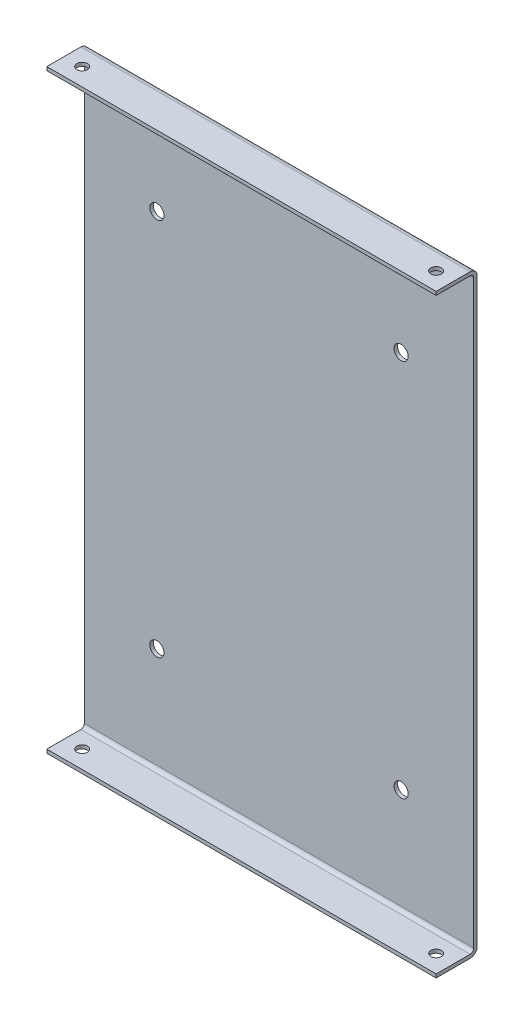
ISO-10303-21;
HEADER;
FILE_DESCRIPTION(('STEP AP214'),'2;1');
FILE_NAME('part.step','',(''),(''),'','','');
FILE_SCHEMA(('AUTOMOTIVE_DESIGN { 1 0 10303 214 1 1 1 1 }'));
ENDSEC;
DATA;
#1=APPLICATION_CONTEXT('core data for automotive mechanical design processes');
#2=APPLICATION_PROTOCOL_DEFINITION('international standard','automotive_design',2000,#1);
#3=PRODUCT_CONTEXT('',#1,'mechanical');
#4=PRODUCT('Part','Part','',(#3));
#5=PRODUCT_RELATED_PRODUCT_CATEGORY('part','',(#4));
#6=PRODUCT_DEFINITION_FORMATION('','',#4);
#7=PRODUCT_DEFINITION_CONTEXT('part definition',#1,'design');
#8=PRODUCT_DEFINITION('design','',#6,#7);
#9=PRODUCT_DEFINITION_SHAPE('','',#8);
#10=(LENGTH_UNIT() NAMED_UNIT(*) SI_UNIT(.MILLI.,.METRE.));
#11=(NAMED_UNIT(*) PLANE_ANGLE_UNIT() SI_UNIT($,.RADIAN.));
#12=(NAMED_UNIT(*) SI_UNIT($,.STERADIAN.) SOLID_ANGLE_UNIT());
#13=UNCERTAINTY_MEASURE_WITH_UNIT(LENGTH_MEASURE(1.E-05),#10,'distance_accuracy_value','');
#14=(GEOMETRIC_REPRESENTATION_CONTEXT(3) GLOBAL_UNCERTAINTY_ASSIGNED_CONTEXT((#13)) GLOBAL_UNIT_ASSIGNED_CONTEXT((#10,
#11,#12)) REPRESENTATION_CONTEXT('',''));
#15=CARTESIAN_POINT('',(0.,0.,0.));
#16=DIRECTION('',(0.,0.,1.));
#17=DIRECTION('',(1.,0.,0.));
#18=AXIS2_PLACEMENT_3D('',#15,#16,#17);
#19=CARTESIAN_POINT('',(0.,0.,1.));
#20=DIRECTION('',(0.,0.,1.));
#21=DIRECTION('',(1.,0.,0.));
#22=AXIS2_PLACEMENT_3D('',#19,#20,#21);
#23=PLANE('',#22);
#24=CARTESIAN_POINT('',(20.5,-137.5,1.));
#25=DIRECTION('',(0.,0.,1.));
#26=DIRECTION('',(1.,0.,0.));
#27=AXIS2_PLACEMENT_3D('',#24,#25,#26);
#28=CIRCLE('',#27,2.00000000000001);
#29=CARTESIAN_POINT('',(22.5,-137.5,1.));
#30=VERTEX_POINT('',#29);
#31=EDGE_CURVE('E179',#30,#30,#28,.T.);
#32=ORIENTED_EDGE('',*,*,#31,.F.);
#33=EDGE_LOOP('',(#32));
#34=FACE_BOUND('',#33,.T.);
#35=CARTESIAN_POINT('',(89.5,-30.5,1.));
#36=DIRECTION('',(0.,0.,1.));
#37=DIRECTION('',(1.,0.,0.));
#38=AXIS2_PLACEMENT_3D('',#35,#36,#37);
#39=CIRCLE('',#38,2.);
#40=CARTESIAN_POINT('',(91.5,-30.5,1.));
#41=VERTEX_POINT('',#40);
#42=EDGE_CURVE('E182',#41,#41,#39,.T.);
#43=ORIENTED_EDGE('',*,*,#42,.F.);
#44=EDGE_LOOP('',(#43));
#45=FACE_BOUND('',#44,.T.);
#46=CARTESIAN_POINT('',(89.5,-137.5,1.));
#47=DIRECTION('',(0.,0.,1.));
#48=DIRECTION('',(1.,0.,0.));
#49=AXIS2_PLACEMENT_3D('',#46,#47,#48);
#50=CIRCLE('',#49,2.);
#51=CARTESIAN_POINT('',(91.5,-137.5,1.));
#52=VERTEX_POINT('',#51);
#53=EDGE_CURVE('E186',#52,#52,#50,.T.);
#54=ORIENTED_EDGE('',*,*,#53,.F.);
#55=EDGE_LOOP('',(#54));
#56=FACE_BOUND('',#55,.T.);
#57=CARTESIAN_POINT('',(20.5,-30.5,1.));
#58=DIRECTION('',(0.,0.,1.));
#59=DIRECTION('',(1.,0.,0.));
#60=AXIS2_PLACEMENT_3D('',#57,#58,#59);
#61=CIRCLE('',#60,2.);
#62=CARTESIAN_POINT('',(22.5,-30.5,1.));
#63=VERTEX_POINT('',#62);
#64=EDGE_CURVE('E189',#63,#63,#61,.T.);
#65=ORIENTED_EDGE('',*,*,#64,.F.);
#66=EDGE_LOOP('',(#65));
#67=FACE_BOUND('',#66,.T.);
#68=DIRECTION('',(0.,-1.,0.));
#69=VECTOR('',#68,1.);
#70=CARTESIAN_POINT('',(110.,0.,1.));
#71=LINE('',#70,#69);
#72=CARTESIAN_POINT('',(110.,-2.,1.));
#73=VERTEX_POINT('',#72);
#74=CARTESIAN_POINT('',(110.,-166.,1.));
#75=VERTEX_POINT('',#74);
#76=EDGE_CURVE('E192',#73,#75,#71,.T.);
#77=ORIENTED_EDGE('',*,*,#76,.F.);
#78=DIRECTION('',(1.,0.,0.));
#79=VECTOR('',#78,1.);
#80=CARTESIAN_POINT('',(0.,-2.00000000000001,1.));
#81=LINE('',#80,#79);
#82=CARTESIAN_POINT('',(0.,-2.00000000000001,1.));
#83=VERTEX_POINT('',#82);
#84=EDGE_CURVE('E240',#73,#83,#81,.F.);
#85=ORIENTED_EDGE('',*,*,#84,.T.);
#86=DIRECTION('',(0.,-1.,0.));
#87=VECTOR('',#86,1.);
#88=CARTESIAN_POINT('',(0.,0.,1.));
#89=LINE('',#88,#87);
#90=CARTESIAN_POINT('',(0.,-166.,1.));
#91=VERTEX_POINT('',#90);
#92=EDGE_CURVE('E194',#83,#91,#89,.T.);
#93=ORIENTED_EDGE('',*,*,#92,.T.);
#94=DIRECTION('',(-1.,0.,0.));
#95=VECTOR('',#94,1.);
#96=CARTESIAN_POINT('',(0.,-166.,1.));
#97=LINE('',#96,#95);
#98=EDGE_CURVE('E238',#91,#75,#97,.F.);
#99=ORIENTED_EDGE('',*,*,#98,.T.);
#100=EDGE_LOOP('',(#77,#85,#93,#99));
#101=FACE_BOUND('',#100,.T.);
#102=ADVANCED_FACE('F33',(#34,#45,#56,#67,#101),#23,.T.);
#103=CARTESIAN_POINT('',(110.,0.,1.));
#104=DIRECTION('',(1.,0.,0.));
#105=DIRECTION('',(0.,1.,0.));
#106=AXIS2_PLACEMENT_3D('',#103,#104,#105);
#107=PLANE('',#106);
#108=DIRECTION('',(0.,0.,-1.));
#109=VECTOR('',#108,1.);
#110=CARTESIAN_POINT('',(110.,-168.,1.));
#111=LINE('',#110,#109);
#112=CARTESIAN_POINT('',(110.,-168.,11.6));
#113=VERTEX_POINT('',#112);
#114=CARTESIAN_POINT('',(110.,-168.,2.));
#115=VERTEX_POINT('',#114);
#116=EDGE_CURVE('E197',#113,#115,#111,.T.);
#117=ORIENTED_EDGE('',*,*,#116,.T.);
#118=CARTESIAN_POINT('',(110.,-166.,2.));
#119=DIRECTION('',(1.,0.,0.));
#120=DIRECTION('',(0.,1.,0.));
#121=AXIS2_PLACEMENT_3D('',#118,#119,#120);
#122=CIRCLE('',#121,2.);
#123=CARTESIAN_POINT('',(110.,-166.,0.));
#124=VERTEX_POINT('',#123);
#125=EDGE_CURVE('E222',#115,#124,#122,.T.);
#126=ORIENTED_EDGE('',*,*,#125,.T.);
#127=DIRECTION('',(0.,-1.,0.));
#128=VECTOR('',#127,1.);
#129=CARTESIAN_POINT('',(110.,0.,0.));
#130=LINE('',#129,#128);
#131=CARTESIAN_POINT('',(110.,-2.,0.));
#132=VERTEX_POINT('',#131);
#133=EDGE_CURVE('E209',#132,#124,#130,.T.);
#134=ORIENTED_EDGE('',*,*,#133,.F.);
#135=CARTESIAN_POINT('',(110.,-2.,2.));
#136=DIRECTION('',(1.,0.,0.));
#137=DIRECTION('',(0.,1.,0.));
#138=AXIS2_PLACEMENT_3D('',#135,#136,#137);
#139=CIRCLE('',#138,2.);
#140=CARTESIAN_POINT('',(110.,0.,2.));
#141=VERTEX_POINT('',#140);
#142=EDGE_CURVE('E131',#132,#141,#139,.T.);
#143=ORIENTED_EDGE('',*,*,#142,.T.);
#144=DIRECTION('',(0.,0.,-1.));
#145=VECTOR('',#144,1.);
#146=CARTESIAN_POINT('',(110.,0.,1.));
#147=LINE('',#146,#145);
#148=CARTESIAN_POINT('',(110.,0.,11.6));
#149=VERTEX_POINT('',#148);
#150=EDGE_CURVE('E123',#149,#141,#147,.T.);
#151=ORIENTED_EDGE('',*,*,#150,.F.);
#152=DIRECTION('',(0.,1.,0.));
#153=VECTOR('',#152,1.);
#154=CARTESIAN_POINT('',(110.,0.,11.6));
#155=LINE('',#154,#153);
#156=CARTESIAN_POINT('',(110.,-0.999999999999999,11.6));
#157=VERTEX_POINT('',#156);
#158=EDGE_CURVE('E129',#157,#149,#155,.T.);
#159=ORIENTED_EDGE('',*,*,#158,.F.);
#160=DIRECTION('',(0.,0.,-1.));
#161=VECTOR('',#160,1.);
#162=CARTESIAN_POINT('',(110.,-0.999999999999999,11.6));
#163=LINE('',#162,#161);
#164=CARTESIAN_POINT('',(110.,-0.999999999999999,2.));
#165=VERTEX_POINT('',#164);
#166=EDGE_CURVE('E158',#157,#165,#163,.T.);
#167=ORIENTED_EDGE('',*,*,#166,.T.);
#168=CARTESIAN_POINT('',(110.,-2.,2.));
#169=DIRECTION('',(1.,0.,0.));
#170=DIRECTION('',(0.,1.,0.));
#171=AXIS2_PLACEMENT_3D('',#168,#169,#170);
#172=CIRCLE('',#171,1.);
#173=EDGE_CURVE('E244',#165,#73,#172,.F.);
#174=ORIENTED_EDGE('',*,*,#173,.T.);
#175=ORIENTED_EDGE('',*,*,#76,.T.);
#176=CARTESIAN_POINT('',(110.,-166.,2.));
#177=DIRECTION('',(1.,0.,0.));
#178=DIRECTION('',(0.,1.,0.));
#179=AXIS2_PLACEMENT_3D('',#176,#177,#178);
#180=CIRCLE('',#179,1.);
#181=CARTESIAN_POINT('',(110.,-167.,2.));
#182=VERTEX_POINT('',#181);
#183=EDGE_CURVE('E11',#75,#182,#180,.F.);
#184=ORIENTED_EDGE('',*,*,#183,.T.);
#185=DIRECTION('',(0.,0.,-1.));
#186=VECTOR('',#185,1.);
#187=CARTESIAN_POINT('',(110.,-167.,11.6));
#188=LINE('',#187,#186);
#189=CARTESIAN_POINT('',(110.,-167.,11.6));
#190=VERTEX_POINT('',#189);
#191=EDGE_CURVE('E176',#190,#182,#188,.T.);
#192=ORIENTED_EDGE('',*,*,#191,.F.);
#193=DIRECTION('',(0.,1.,0.));
#194=VECTOR('',#193,1.);
#195=CARTESIAN_POINT('',(110.,-168.,11.6));
#196=LINE('',#195,#194);
#197=EDGE_CURVE('E169',#113,#190,#196,.T.);
#198=ORIENTED_EDGE('',*,*,#197,.F.);
#199=EDGE_LOOP('',(#117,#126,#134,#143,#151,#159,#167,#174,#175,#184,#192,#198));
#200=FACE_BOUND('',#199,.T.);
#201=ADVANCED_FACE('F126',(#200),#107,.T.);
#202=CARTESIAN_POINT('',(0.,0.,1.));
#203=DIRECTION('',(0.,1.,0.));
#204=DIRECTION('',(0.,0.,1.));
#205=AXIS2_PLACEMENT_3D('',#202,#203,#204);
#206=PLANE('',#205);
#207=CARTESIAN_POINT('',(4.99999999999999,0.,6.6));
#208=DIRECTION('',(0.,1.,0.));
#209=DIRECTION('',(0.,0.,1.));
#210=AXIS2_PLACEMENT_3D('',#207,#208,#209);
#211=CIRCLE('',#210,1.5);
#212=CARTESIAN_POINT('',(4.99999999999999,0.,8.1));
#213=VERTEX_POINT('',#212);
#214=EDGE_CURVE('E262',#213,#213,#211,.T.);
#215=ORIENTED_EDGE('',*,*,#214,.F.);
#216=EDGE_LOOP('',(#215));
#217=FACE_BOUND('',#216,.T.);
#218=CARTESIAN_POINT('',(105.,0.,6.6));
#219=DIRECTION('',(0.,1.,0.));
#220=DIRECTION('',(0.,0.,1.));
#221=AXIS2_PLACEMENT_3D('',#218,#219,#220);
#222=CIRCLE('',#221,1.5);
#223=CARTESIAN_POINT('',(105.,0.,8.1));
#224=VERTEX_POINT('',#223);
#225=EDGE_CURVE('E253',#224,#224,#222,.T.);
#226=ORIENTED_EDGE('',*,*,#225,.F.);
#227=EDGE_LOOP('',(#226));
#228=FACE_BOUND('',#227,.T.);
#229=ORIENTED_EDGE('',*,*,#150,.T.);
#230=DIRECTION('',(1.,0.,0.));
#231=VECTOR('',#230,1.);
#232=CARTESIAN_POINT('',(0.,0.,2.));
#233=LINE('',#232,#231);
#234=CARTESIAN_POINT('',(0.,0.,2.));
#235=VERTEX_POINT('',#234);
#236=EDGE_CURVE('E233',#141,#235,#233,.F.);
#237=ORIENTED_EDGE('',*,*,#236,.T.);
#238=DIRECTION('',(0.,0.,-1.));
#239=VECTOR('',#238,1.);
#240=CARTESIAN_POINT('',(0.,0.,1.));
#241=LINE('',#240,#239);
#242=CARTESIAN_POINT('',(0.,0.,11.6));
#243=VERTEX_POINT('',#242);
#244=EDGE_CURVE('E135',#243,#235,#241,.T.);
#245=ORIENTED_EDGE('',*,*,#244,.F.);
#246=DIRECTION('',(-1.,0.,0.));
#247=VECTOR('',#246,1.);
#248=CARTESIAN_POINT('',(110.,0.,11.6));
#249=LINE('',#248,#247);
#250=EDGE_CURVE('E138',#149,#243,#249,.T.);
#251=ORIENTED_EDGE('',*,*,#250,.F.);
#252=EDGE_LOOP('',(#229,#237,#245,#251));
#253=FACE_BOUND('',#252,.T.);
#254=ADVANCED_FACE('F139',(#217,#228,#253),#206,.T.);
#255=CARTESIAN_POINT('',(0.,0.,1.));
#256=DIRECTION('',(1.,0.,0.));
#257=DIRECTION('',(0.,1.,0.));
#258=AXIS2_PLACEMENT_3D('',#255,#256,#257);
#259=PLANE('',#258);
#260=DIRECTION('',(0.,-1.,0.));
#261=VECTOR('',#260,1.);
#262=CARTESIAN_POINT('',(0.,0.,0.));
#263=LINE('',#262,#261);
#264=CARTESIAN_POINT('',(0.,-2.,0.));
#265=VERTEX_POINT('',#264);
#266=CARTESIAN_POINT('',(0.,-166.,0.));
#267=VERTEX_POINT('',#266);
#268=EDGE_CURVE('E183',#265,#267,#263,.T.);
#269=ORIENTED_EDGE('',*,*,#268,.T.);
#270=CARTESIAN_POINT('',(0.,-166.,2.));
#271=DIRECTION('',(1.,0.,0.));
#272=DIRECTION('',(0.,1.,0.));
#273=AXIS2_PLACEMENT_3D('',#270,#271,#272);
#274=CIRCLE('',#273,2.);
#275=CARTESIAN_POINT('',(0.,-168.,2.));
#276=VERTEX_POINT('',#275);
#277=EDGE_CURVE('E231',#267,#276,#274,.F.);
#278=ORIENTED_EDGE('',*,*,#277,.T.);
#279=DIRECTION('',(0.,0.,-1.));
#280=VECTOR('',#279,1.);
#281=CARTESIAN_POINT('',(0.,-168.,1.));
#282=LINE('',#281,#280);
#283=CARTESIAN_POINT('',(0.,-168.,11.6));
#284=VERTEX_POINT('',#283);
#285=EDGE_CURVE('E215',#284,#276,#282,.T.);
#286=ORIENTED_EDGE('',*,*,#285,.F.);
#287=DIRECTION('',(0.,-1.,0.));
#288=VECTOR('',#287,1.);
#289=CARTESIAN_POINT('',(0.,-168.,11.6));
#290=LINE('',#289,#288);
#291=CARTESIAN_POINT('',(0.,-167.,11.6));
#292=VERTEX_POINT('',#291);
#293=EDGE_CURVE('E163',#292,#284,#290,.T.);
#294=ORIENTED_EDGE('',*,*,#293,.F.);
#295=DIRECTION('',(0.,0.,-1.));
#296=VECTOR('',#295,1.);
#297=CARTESIAN_POINT('',(0.,-167.,11.6));
#298=LINE('',#297,#296);
#299=CARTESIAN_POINT('',(0.,-167.,2.));
#300=VERTEX_POINT('',#299);
#301=EDGE_CURVE('E173',#292,#300,#298,.T.);
#302=ORIENTED_EDGE('',*,*,#301,.T.);
#303=CARTESIAN_POINT('',(0.,-166.,2.));
#304=DIRECTION('',(1.,0.,0.));
#305=DIRECTION('',(0.,1.,0.));
#306=AXIS2_PLACEMENT_3D('',#303,#304,#305);
#307=CIRCLE('',#306,1.);
#308=EDGE_CURVE('E42',#300,#91,#307,.T.);
#309=ORIENTED_EDGE('',*,*,#308,.T.);
#310=ORIENTED_EDGE('',*,*,#92,.F.);
#311=CARTESIAN_POINT('',(0.,-2.00000000000001,2.));
#312=DIRECTION('',(1.,0.,0.));
#313=DIRECTION('',(0.,1.,0.));
#314=AXIS2_PLACEMENT_3D('',#311,#312,#313);
#315=CIRCLE('',#314,1.);
#316=CARTESIAN_POINT('',(0.,-1.00000000000001,2.));
#317=VERTEX_POINT('',#316);
#318=EDGE_CURVE('E246',#83,#317,#315,.T.);
#319=ORIENTED_EDGE('',*,*,#318,.T.);
#320=DIRECTION('',(0.,0.,-1.));
#321=VECTOR('',#320,1.);
#322=CARTESIAN_POINT('',(0.,-1.00000000000001,11.6));
#323=LINE('',#322,#321);
#324=CARTESIAN_POINT('',(0.,-1.00000000000001,11.6));
#325=VERTEX_POINT('',#324);
#326=EDGE_CURVE('E160',#325,#317,#323,.T.);
#327=ORIENTED_EDGE('',*,*,#326,.F.);
#328=DIRECTION('',(0.,-1.,0.));
#329=VECTOR('',#328,1.);
#330=CARTESIAN_POINT('',(0.,0.,11.6));
#331=LINE('',#330,#329);
#332=EDGE_CURVE('E143',#243,#325,#331,.T.);
#333=ORIENTED_EDGE('',*,*,#332,.F.);
#334=ORIENTED_EDGE('',*,*,#244,.T.);
#335=CARTESIAN_POINT('',(0.,-2.,2.));
#336=DIRECTION('',(1.,0.,0.));
#337=DIRECTION('',(0.,1.,0.));
#338=AXIS2_PLACEMENT_3D('',#335,#336,#337);
#339=CIRCLE('',#338,2.);
#340=EDGE_CURVE('E229',#235,#265,#339,.F.);
#341=ORIENTED_EDGE('',*,*,#340,.T.);
#342=EDGE_LOOP('',(#269,#278,#286,#294,#302,#309,#310,#319,#327,#333,#334,#341));
#343=FACE_BOUND('',#342,.T.);
#344=ADVANCED_FACE('F309',(#343),#259,.F.);
#345=CARTESIAN_POINT('',(20.5,-30.5,1.));
#346=DIRECTION('',(0.,0.,-1.));
#347=DIRECTION('',(-1.,0.,0.));
#348=AXIS2_PLACEMENT_3D('',#345,#346,#347);
#349=CYLINDRICAL_SURFACE('',#348,2.);
#350=ORIENTED_EDGE('',*,*,#64,.T.);
#351=EDGE_LOOP('',(#350));
#352=FACE_BOUND('',#351,.T.);
#353=CARTESIAN_POINT('',(20.5,-30.5,0.));
#354=DIRECTION('',(0.,0.,1.));
#355=DIRECTION('',(1.,0.,0.));
#356=AXIS2_PLACEMENT_3D('',#353,#354,#355);
#357=CIRCLE('',#356,2.);
#358=CARTESIAN_POINT('',(22.5,-30.5,0.));
#359=VERTEX_POINT('',#358);
#360=EDGE_CURVE('E206',#359,#359,#357,.T.);
#361=ORIENTED_EDGE('',*,*,#360,.F.);
#362=EDGE_LOOP('',(#361));
#363=FACE_BOUND('',#362,.T.);
#364=ADVANCED_FACE('F312',(#352,#363),#349,.F.);
#365=CARTESIAN_POINT('',(89.5,-137.5,1.));
#366=DIRECTION('',(0.,0.,-1.));
#367=DIRECTION('',(-1.,0.,0.));
#368=AXIS2_PLACEMENT_3D('',#365,#366,#367);
#369=CYLINDRICAL_SURFACE('',#368,2.);
#370=ORIENTED_EDGE('',*,*,#53,.T.);
#371=EDGE_LOOP('',(#370));
#372=FACE_BOUND('',#371,.T.);
#373=CARTESIAN_POINT('',(89.5,-137.5,0.));
#374=DIRECTION('',(0.,0.,1.));
#375=DIRECTION('',(1.,0.,0.));
#376=AXIS2_PLACEMENT_3D('',#373,#374,#375);
#377=CIRCLE('',#376,2.);
#378=CARTESIAN_POINT('',(91.5,-137.5,0.));
#379=VERTEX_POINT('',#378);
#380=EDGE_CURVE('E203',#379,#379,#377,.T.);
#381=ORIENTED_EDGE('',*,*,#380,.F.);
#382=EDGE_LOOP('',(#381));
#383=FACE_BOUND('',#382,.T.);
#384=ADVANCED_FACE('F319',(#372,#383),#369,.F.);
#385=CARTESIAN_POINT('',(89.5,-30.5,1.));
#386=DIRECTION('',(0.,0.,-1.));
#387=DIRECTION('',(-1.,0.,0.));
#388=AXIS2_PLACEMENT_3D('',#385,#386,#387);
#389=CYLINDRICAL_SURFACE('',#388,2.);
#390=ORIENTED_EDGE('',*,*,#42,.T.);
#391=EDGE_LOOP('',(#390));
#392=FACE_BOUND('',#391,.T.);
#393=CARTESIAN_POINT('',(89.5,-30.5,0.));
#394=DIRECTION('',(0.,0.,1.));
#395=DIRECTION('',(1.,0.,0.));
#396=AXIS2_PLACEMENT_3D('',#393,#394,#395);
#397=CIRCLE('',#396,2.);
#398=CARTESIAN_POINT('',(91.5,-30.5,0.));
#399=VERTEX_POINT('',#398);
#400=EDGE_CURVE('E200',#399,#399,#397,.T.);
#401=ORIENTED_EDGE('',*,*,#400,.F.);
#402=EDGE_LOOP('',(#401));
#403=FACE_BOUND('',#402,.T.);
#404=ADVANCED_FACE('F323',(#392,#403),#389,.F.);
#405=CARTESIAN_POINT('',(20.5,-137.5,1.));
#406=DIRECTION('',(0.,0.,-1.));
#407=DIRECTION('',(-1.,0.,0.));
#408=AXIS2_PLACEMENT_3D('',#405,#406,#407);
#409=CYLINDRICAL_SURFACE('',#408,2.00000000000001);
#410=ORIENTED_EDGE('',*,*,#31,.T.);
#411=EDGE_LOOP('',(#410));
#412=FACE_BOUND('',#411,.T.);
#413=CARTESIAN_POINT('',(20.5,-137.5,0.));
#414=DIRECTION('',(0.,0.,1.));
#415=DIRECTION('',(1.,0.,0.));
#416=AXIS2_PLACEMENT_3D('',#413,#414,#415);
#417=CIRCLE('',#416,2.00000000000001);
#418=CARTESIAN_POINT('',(22.5,-137.5,0.));
#419=VERTEX_POINT('',#418);
#420=EDGE_CURVE('E178',#419,#419,#417,.T.);
#421=ORIENTED_EDGE('',*,*,#420,.F.);
#422=EDGE_LOOP('',(#421));
#423=FACE_BOUND('',#422,.T.);
#424=ADVANCED_FACE('F308',(#412,#423),#409,.F.);
#425=CARTESIAN_POINT('',(0.,-168.,1.));
#426=DIRECTION('',(0.,1.,0.));
#427=DIRECTION('',(0.,0.,1.));
#428=AXIS2_PLACEMENT_3D('',#425,#426,#427);
#429=PLANE('',#428);
#430=CARTESIAN_POINT('',(4.99999999999999,-168.,6.6));
#431=DIRECTION('',(0.,1.,0.));
#432=DIRECTION('',(0.,0.,1.));
#433=AXIS2_PLACEMENT_3D('',#430,#431,#432);
#434=CIRCLE('',#433,1.5);
#435=CARTESIAN_POINT('',(4.99999999999999,-168.,8.1));
#436=VERTEX_POINT('',#435);
#437=EDGE_CURVE('E265',#436,#436,#434,.T.);
#438=ORIENTED_EDGE('',*,*,#437,.T.);
#439=EDGE_LOOP('',(#438));
#440=FACE_BOUND('',#439,.T.);
#441=CARTESIAN_POINT('',(105.,-168.,6.6));
#442=DIRECTION('',(0.,1.,0.));
#443=DIRECTION('',(0.,0.,1.));
#444=AXIS2_PLACEMENT_3D('',#441,#442,#443);
#445=CIRCLE('',#444,1.5);
#446=CARTESIAN_POINT('',(105.,-168.,8.1));
#447=VERTEX_POINT('',#446);
#448=EDGE_CURVE('E249',#447,#447,#445,.T.);
#449=ORIENTED_EDGE('',*,*,#448,.T.);
#450=EDGE_LOOP('',(#449));
#451=FACE_BOUND('',#450,.T.);
#452=ORIENTED_EDGE('',*,*,#285,.T.);
#453=DIRECTION('',(1.,0.,0.));
#454=VECTOR('',#453,1.);
#455=CARTESIAN_POINT('',(0.,-168.,2.));
#456=LINE('',#455,#454);
#457=EDGE_CURVE('E134',#276,#115,#456,.T.);
#458=ORIENTED_EDGE('',*,*,#457,.T.);
#459=ORIENTED_EDGE('',*,*,#116,.F.);
#460=DIRECTION('',(1.,0.,0.));
#461=VECTOR('',#460,1.);
#462=CARTESIAN_POINT('',(0.,-168.,11.6));
#463=LINE('',#462,#461);
#464=EDGE_CURVE('E166',#284,#113,#463,.T.);
#465=ORIENTED_EDGE('',*,*,#464,.F.);
#466=EDGE_LOOP('',(#452,#458,#459,#465));
#467=FACE_BOUND('',#466,.T.);
#468=ADVANCED_FACE('F304',(#440,#451,#467),#429,.F.);
#469=CARTESIAN_POINT('',(0.,0.,0.));
#470=DIRECTION('',(0.,0.,1.));
#471=DIRECTION('',(1.,0.,0.));
#472=AXIS2_PLACEMENT_3D('',#469,#470,#471);
#473=PLANE('',#472);
#474=ORIENTED_EDGE('',*,*,#420,.T.);
#475=EDGE_LOOP('',(#474));
#476=FACE_BOUND('',#475,.T.);
#477=ORIENTED_EDGE('',*,*,#400,.T.);
#478=EDGE_LOOP('',(#477));
#479=FACE_BOUND('',#478,.T.);
#480=ORIENTED_EDGE('',*,*,#380,.T.);
#481=EDGE_LOOP('',(#480));
#482=FACE_BOUND('',#481,.T.);
#483=ORIENTED_EDGE('',*,*,#360,.T.);
#484=EDGE_LOOP('',(#483));
#485=FACE_BOUND('',#484,.T.);
#486=ORIENTED_EDGE('',*,*,#133,.T.);
#487=DIRECTION('',(1.,0.,0.));
#488=VECTOR('',#487,1.);
#489=CARTESIAN_POINT('',(0.,-166.,0.));
#490=LINE('',#489,#488);
#491=EDGE_CURVE('E227',#124,#267,#490,.F.);
#492=ORIENTED_EDGE('',*,*,#491,.T.);
#493=ORIENTED_EDGE('',*,*,#268,.F.);
#494=DIRECTION('',(1.,0.,0.));
#495=VECTOR('',#494,1.);
#496=CARTESIAN_POINT('',(110.,-2.,0.));
#497=LINE('',#496,#495);
#498=EDGE_CURVE('E224',#265,#132,#497,.T.);
#499=ORIENTED_EDGE('',*,*,#498,.T.);
#500=EDGE_LOOP('',(#486,#492,#493,#499));
#501=FACE_BOUND('',#500,.T.);
#502=ADVANCED_FACE('F301',(#476,#479,#482,#485,#501),#473,.F.);
#503=CARTESIAN_POINT('',(0.,-167.,11.6));
#504=DIRECTION('',(0.,-1.,0.));
#505=DIRECTION('',(0.,0.,-1.));
#506=AXIS2_PLACEMENT_3D('',#503,#504,#505);
#507=PLANE('',#506);
#508=CARTESIAN_POINT('',(4.99999999999999,-167.,6.6));
#509=DIRECTION('',(0.,-1.,0.));
#510=DIRECTION('',(0.,0.,-1.));
#511=AXIS2_PLACEMENT_3D('',#508,#509,#510);
#512=CIRCLE('',#511,1.5);
#513=CARTESIAN_POINT('',(4.99999999999999,-167.,8.1));
#514=VERTEX_POINT('',#513);
#515=EDGE_CURVE('E258',#514,#514,#512,.T.);
#516=ORIENTED_EDGE('',*,*,#515,.T.);
#517=EDGE_LOOP('',(#516));
#518=FACE_BOUND('',#517,.T.);
#519=CARTESIAN_POINT('',(105.,-167.,6.6));
#520=DIRECTION('',(0.,-1.,0.));
#521=DIRECTION('',(0.,0.,-1.));
#522=AXIS2_PLACEMENT_3D('',#519,#520,#521);
#523=CIRCLE('',#522,1.5);
#524=CARTESIAN_POINT('',(105.,-167.,8.1));
#525=VERTEX_POINT('',#524);
#526=EDGE_CURVE('E149',#525,#525,#523,.T.);
#527=ORIENTED_EDGE('',*,*,#526,.T.);
#528=EDGE_LOOP('',(#527));
#529=FACE_BOUND('',#528,.T.);
#530=ORIENTED_EDGE('',*,*,#191,.T.);
#531=DIRECTION('',(-1.,0.,0.));
#532=VECTOR('',#531,1.);
#533=CARTESIAN_POINT('',(0.,-167.,2.));
#534=LINE('',#533,#532);
#535=EDGE_CURVE('E242',#182,#300,#534,.T.);
#536=ORIENTED_EDGE('',*,*,#535,.T.);
#537=ORIENTED_EDGE('',*,*,#301,.F.);
#538=DIRECTION('',(-1.,0.,0.));
#539=VECTOR('',#538,1.);
#540=CARTESIAN_POINT('',(0.,-167.,11.6));
#541=LINE('',#540,#539);
#542=EDGE_CURVE('E171',#190,#292,#541,.T.);
#543=ORIENTED_EDGE('',*,*,#542,.F.);
#544=EDGE_LOOP('',(#530,#536,#537,#543));
#545=FACE_BOUND('',#544,.T.);
#546=ADVANCED_FACE('F299',(#518,#529,#545),#507,.F.);
#547=CARTESIAN_POINT('',(0.,0.,11.6));
#548=DIRECTION('',(0.,0.,-1.));
#549=DIRECTION('',(-1.,0.,0.));
#550=AXIS2_PLACEMENT_3D('',#547,#548,#549);
#551=PLANE('',#550);
#552=ORIENTED_EDGE('',*,*,#293,.T.);
#553=ORIENTED_EDGE('',*,*,#464,.T.);
#554=ORIENTED_EDGE('',*,*,#197,.T.);
#555=ORIENTED_EDGE('',*,*,#542,.T.);
#556=EDGE_LOOP('',(#552,#553,#554,#555));
#557=FACE_BOUND('',#556,.T.);
#558=ADVANCED_FACE('F358',(#557),#551,.F.);
#559=CARTESIAN_POINT('',(110.,-0.999999999999999,11.6));
#560=DIRECTION('',(0.,1.,0.));
#561=DIRECTION('',(-1.,0.,0.));
#562=AXIS2_PLACEMENT_3D('',#559,#560,#561);
#563=PLANE('',#562);
#564=CARTESIAN_POINT('',(4.99999999999999,-1.,6.6));
#565=DIRECTION('',(0.,1.,0.));
#566=DIRECTION('',(-1.,0.,0.));
#567=AXIS2_PLACEMENT_3D('',#564,#565,#566);
#568=CIRCLE('',#567,1.5);
#569=CARTESIAN_POINT('',(4.99999999999999,-1.,8.1));
#570=VERTEX_POINT('',#569);
#571=EDGE_CURVE('E37',#570,#570,#568,.T.);
#572=ORIENTED_EDGE('',*,*,#571,.T.);
#573=EDGE_LOOP('',(#572));
#574=FACE_BOUND('',#573,.T.);
#575=CARTESIAN_POINT('',(105.,-1.,6.6));
#576=DIRECTION('',(0.,1.,0.));
#577=DIRECTION('',(-1.,0.,0.));
#578=AXIS2_PLACEMENT_3D('',#575,#576,#577);
#579=CIRCLE('',#578,1.5);
#580=CARTESIAN_POINT('',(105.,-1.,8.1));
#581=VERTEX_POINT('',#580);
#582=EDGE_CURVE('E152',#581,#581,#579,.T.);
#583=ORIENTED_EDGE('',*,*,#582,.T.);
#584=EDGE_LOOP('',(#583));
#585=FACE_BOUND('',#584,.T.);
#586=ORIENTED_EDGE('',*,*,#326,.T.);
#587=DIRECTION('',(1.,0.,0.));
#588=VECTOR('',#587,1.);
#589=CARTESIAN_POINT('',(110.,-0.999999999999999,2.));
#590=LINE('',#589,#588);
#591=EDGE_CURVE('E235',#317,#165,#590,.T.);
#592=ORIENTED_EDGE('',*,*,#591,.T.);
#593=ORIENTED_EDGE('',*,*,#166,.F.);
#594=DIRECTION('',(1.,0.,0.));
#595=VECTOR('',#594,1.);
#596=CARTESIAN_POINT('',(110.,-0.999999999999999,11.6));
#597=LINE('',#596,#595);
#598=EDGE_CURVE('E147',#325,#157,#597,.T.);
#599=ORIENTED_EDGE('',*,*,#598,.F.);
#600=EDGE_LOOP('',(#586,#592,#593,#599));
#601=FACE_BOUND('',#600,.T.);
#602=ADVANCED_FACE('F272',(#574,#585,#601),#563,.F.);
#603=CARTESIAN_POINT('',(0.,0.,11.6));
#604=DIRECTION('',(0.,0.,-1.));
#605=DIRECTION('',(-1.,0.,0.));
#606=AXIS2_PLACEMENT_3D('',#603,#604,#605);
#607=PLANE('',#606);
#608=ORIENTED_EDGE('',*,*,#158,.T.);
#609=ORIENTED_EDGE('',*,*,#250,.T.);
#610=ORIENTED_EDGE('',*,*,#332,.T.);
#611=ORIENTED_EDGE('',*,*,#598,.T.);
#612=EDGE_LOOP('',(#608,#609,#610,#611));
#613=FACE_BOUND('',#612,.T.);
#614=ADVANCED_FACE('F145',(#613),#607,.F.);
#615=CARTESIAN_POINT('',(0.,-166.,2.));
#616=DIRECTION('',(1.,0.,0.));
#617=DIRECTION('',(0.,0.,-1.));
#618=AXIS2_PLACEMENT_3D('',#615,#616,#617);
#619=CYLINDRICAL_SURFACE('',#618,2.);
#620=ORIENTED_EDGE('',*,*,#277,.F.);
#621=ORIENTED_EDGE('',*,*,#491,.F.);
#622=ORIENTED_EDGE('',*,*,#125,.F.);
#623=ORIENTED_EDGE('',*,*,#457,.F.);
#624=EDGE_LOOP('',(#620,#621,#622,#623));
#625=FACE_BOUND('',#624,.T.);
#626=ADVANCED_FACE('F331',(#625),#619,.T.);
#627=CARTESIAN_POINT('',(0.,-2.,2.));
#628=DIRECTION('',(-1.,0.,0.));
#629=DIRECTION('',(0.,0.,1.));
#630=AXIS2_PLACEMENT_3D('',#627,#628,#629);
#631=CYLINDRICAL_SURFACE('',#630,2.);
#632=ORIENTED_EDGE('',*,*,#340,.F.);
#633=ORIENTED_EDGE('',*,*,#236,.F.);
#634=ORIENTED_EDGE('',*,*,#142,.F.);
#635=ORIENTED_EDGE('',*,*,#498,.F.);
#636=EDGE_LOOP('',(#632,#633,#634,#635));
#637=FACE_BOUND('',#636,.T.);
#638=ADVANCED_FACE('F334',(#637),#631,.T.);
#639=CARTESIAN_POINT('',(110.,-2.,2.));
#640=DIRECTION('',(1.,0.,0.));
#641=DIRECTION('',(0.,1.,0.));
#642=AXIS2_PLACEMENT_3D('',#639,#640,#641);
#643=CYLINDRICAL_SURFACE('',#642,1.);
#644=ORIENTED_EDGE('',*,*,#318,.F.);
#645=ORIENTED_EDGE('',*,*,#84,.F.);
#646=ORIENTED_EDGE('',*,*,#173,.F.);
#647=ORIENTED_EDGE('',*,*,#591,.F.);
#648=EDGE_LOOP('',(#644,#645,#646,#647));
#649=FACE_BOUND('',#648,.T.);
#650=ADVANCED_FACE('F337',(#649),#643,.F.);
#651=CARTESIAN_POINT('',(0.,-166.,2.));
#652=DIRECTION('',(-1.,0.,0.));
#653=DIRECTION('',(0.,0.,1.));
#654=AXIS2_PLACEMENT_3D('',#651,#652,#653);
#655=CYLINDRICAL_SURFACE('',#654,1.);
#656=ORIENTED_EDGE('',*,*,#183,.F.);
#657=ORIENTED_EDGE('',*,*,#98,.F.);
#658=ORIENTED_EDGE('',*,*,#308,.F.);
#659=ORIENTED_EDGE('',*,*,#535,.F.);
#660=EDGE_LOOP('',(#656,#657,#658,#659));
#661=FACE_BOUND('',#660,.T.);
#662=ADVANCED_FACE('F35',(#661),#655,.F.);
#663=CARTESIAN_POINT('',(105.,-168.,6.6));
#664=DIRECTION('',(0.,1.,0.));
#665=DIRECTION('',(0.,0.,1.));
#666=AXIS2_PLACEMENT_3D('',#663,#664,#665);
#667=CYLINDRICAL_SURFACE('',#666,1.5);
#668=CARTESIAN_POINT('',(105.,0.,8.1));
#669=CARTESIAN_POINT('',(105.,-0.0104166666666701,8.1));
#670=CARTESIAN_POINT('',(105.,-0.0208333333333403,8.1));
#671=CARTESIAN_POINT('',(105.,-0.0416666666666713,8.1));
#672=CARTESIAN_POINT('',(105.,-0.0520833333333322,8.1));
#673=CARTESIAN_POINT('',(105.,-0.0729166666666633,8.1));
#674=CARTESIAN_POINT('',(105.,-0.0833333333333334,8.1));
#675=CARTESIAN_POINT('',(105.,-0.104166666666664,8.1));
#676=CARTESIAN_POINT('',(105.,-0.114583333333325,8.1));
#677=CARTESIAN_POINT('',(105.,-0.135416666666656,8.1));
#678=CARTESIAN_POINT('',(105.,-0.145833333333327,8.1));
#679=CARTESIAN_POINT('',(105.,-0.166666666666667,8.1));
#680=CARTESIAN_POINT('',(105.,-0.177083333333337,8.1));
#681=CARTESIAN_POINT('',(105.,-0.197916666666668,8.1));
#682=CARTESIAN_POINT('',(105.,-0.208333333333329,8.1));
#683=CARTESIAN_POINT('',(105.,-0.22916666666666,8.1));
#684=CARTESIAN_POINT('',(105.,-0.23958333333333,8.1));
#685=CARTESIAN_POINT('',(105.,-0.26041666666667,8.1));
#686=CARTESIAN_POINT('',(105.,-0.270833333333341,8.1));
#687=CARTESIAN_POINT('',(105.,-0.291666666666672,8.1));
#688=CARTESIAN_POINT('',(105.,-0.302083333333332,8.1));
#689=CARTESIAN_POINT('',(105.,-0.322916666666663,8.1));
#690=CARTESIAN_POINT('',(105.,-0.333333333333334,8.1));
#691=CARTESIAN_POINT('',(105.,-0.354166666666674,8.1));
#692=CARTESIAN_POINT('',(105.,-0.364583333333344,8.1));
#693=CARTESIAN_POINT('',(105.,-0.385416666666675,8.1));
#694=CARTESIAN_POINT('',(105.,-0.395833333333336,8.1));
#695=CARTESIAN_POINT('',(105.,-0.416666666666667,8.1));
#696=CARTESIAN_POINT('',(105.,-0.427083333333337,8.1));
#697=CARTESIAN_POINT('',(105.,-0.447916666666668,8.1));
#698=CARTESIAN_POINT('',(105.,-0.458333333333329,8.1));
#699=CARTESIAN_POINT('',(105.,-0.47916666666666,8.1));
#700=CARTESIAN_POINT('',(105.,-0.48958333333333,8.1));
#701=CARTESIAN_POINT('',(105.,-0.510416666666671,8.1));
#702=CARTESIAN_POINT('',(105.,-0.520833333333341,8.1));
#703=CARTESIAN_POINT('',(105.,-0.541666666666672,8.1));
#704=CARTESIAN_POINT('',(105.,-0.552083333333333,8.1));
#705=CARTESIAN_POINT('',(105.,-0.572916666666664,8.1));
#706=CARTESIAN_POINT('',(105.,-0.583333333333334,8.1));
#707=CARTESIAN_POINT('',(105.,-0.604166666666665,8.1));
#708=CARTESIAN_POINT('',(105.,-0.614583333333326,8.1));
#709=CARTESIAN_POINT('',(105.,-0.635416666666657,8.1));
#710=CARTESIAN_POINT('',(105.,-0.645833333333327,8.1));
#711=CARTESIAN_POINT('',(105.,-0.666666666666667,8.1));
#712=CARTESIAN_POINT('',(105.,-0.677083333333337,8.1));
#713=CARTESIAN_POINT('',(105.,-0.697916666666668,8.1));
#714=CARTESIAN_POINT('',(105.,-0.708333333333329,8.1));
#715=CARTESIAN_POINT('',(105.,-0.72916666666666,8.1));
#716=CARTESIAN_POINT('',(105.,-0.73958333333333,8.1));
#717=CARTESIAN_POINT('',(105.,-0.760416666666671,8.1));
#718=CARTESIAN_POINT('',(105.,-0.770833333333341,8.1));
#719=CARTESIAN_POINT('',(105.,-0.791666666666672,8.1));
#720=CARTESIAN_POINT('',(105.,-0.802083333333333,8.1));
#721=CARTESIAN_POINT('',(105.,-0.822916666666664,8.1));
#722=CARTESIAN_POINT('',(105.,-0.833333333333334,8.1));
#723=CARTESIAN_POINT('',(105.,-0.854166666666674,8.1));
#724=CARTESIAN_POINT('',(105.,-0.864583333333344,8.1));
#725=CARTESIAN_POINT('',(105.,-0.885416666666676,8.1));
#726=CARTESIAN_POINT('',(105.,-0.895833333333336,8.1));
#727=CARTESIAN_POINT('',(105.,-0.916666666666668,8.1));
#728=CARTESIAN_POINT('',(105.,-0.927083333333338,8.1));
#729=CARTESIAN_POINT('',(105.,-0.947916666666669,8.1));
#730=CARTESIAN_POINT('',(105.,-0.95833333333333,8.1));
#731=CARTESIAN_POINT('',(105.,-0.979166666666661,8.1));
#732=CARTESIAN_POINT('',(105.,-0.989583333333331,8.1));
#733=CARTESIAN_POINT('',(105.,-1.,8.1));
#734=B_SPLINE_CURVE_WITH_KNOTS('',3,(#668,#669,#670,#671,#672,#673,#674,#675,#676,#677,#678,
#679,#680,#681,#682,#683,#684,#685,#686,#687,#688,#689,#690,#691,#692,#693,#694,#695,#696,#697,
#698,#699,#700,#701,#702,#703,#704,#705,#706,#707,#708,#709,#710,#711,#712,#713,#714,#715,#716,
#717,#718,#719,#720,#721,#722,#723,#724,#725,#726,#727,#728,#729,#730,#731,#732,#733),
.UNSPECIFIED.,.F.,.F.,(4,2,2,2,2,2,2,2,2,2,2,2,2,2,2,2,2,2,2,2,2,2,2,2,2,2,2,2,2,2,2,2,4),(0.,
0.0312500000000104,0.0624999999999931,0.0937500000000036,0.124999999999986,0.156249999999997,
0.187500000000007,0.21874999999999,0.25,0.281250000000011,0.312499999999993,0.343750000000004,
0.375000000000014,0.406249999999997,0.437500000000007,0.46874999999999,0.5,0.531250000000011,
0.562499999999994,0.593750000000004,0.624999999999987,0.656249999999997,0.687500000000008,
0.71874999999999,0.750000000000001,0.781250000000011,0.812499999999994,0.843750000000004,
0.875000000000015,0.906249999999997,0.937500000000008,0.96874999999999,1.),.UNSPECIFIED.);
#735=EDGE_CURVE('BSEAM285',#224,#581,#734,.T.);
#736=ORIENTED_EDGE('',*,*,#225,.T.);
#737=ORIENTED_EDGE('',*,*,#582,.F.);
#738=ORIENTED_EDGE('',*,*,#735,.T.);
#739=ORIENTED_EDGE('',*,*,#735,.F.);
#740=EDGE_LOOP('',(#736,#738,#737,#739));
#741=FACE_BOUND('',#740,.T.);
#742=ADVANCED_FACE('F285',(#741),#667,.F.);
#743=CARTESIAN_POINT('',(105.,-168.,8.1));
#744=CARTESIAN_POINT('',(105.,-167.989583333333,8.1));
#745=CARTESIAN_POINT('',(105.,-167.979166666667,8.1));
#746=CARTESIAN_POINT('',(105.,-167.958333333333,8.1));
#747=CARTESIAN_POINT('',(105.,-167.947916666667,8.1));
#748=CARTESIAN_POINT('',(105.,-167.927083333333,8.1));
#749=CARTESIAN_POINT('',(105.,-167.916666666667,8.1));
#750=CARTESIAN_POINT('',(105.,-167.895833333333,8.1));
#751=CARTESIAN_POINT('',(105.,-167.885416666667,8.1));
#752=CARTESIAN_POINT('',(105.,-167.864583333333,8.1));
#753=CARTESIAN_POINT('',(105.,-167.854166666667,8.1));
#754=CARTESIAN_POINT('',(105.,-167.833333333333,8.1));
#755=CARTESIAN_POINT('',(105.,-167.822916666667,8.1));
#756=CARTESIAN_POINT('',(105.,-167.802083333333,8.1));
#757=CARTESIAN_POINT('',(105.,-167.791666666667,8.1));
#758=CARTESIAN_POINT('',(105.,-167.770833333333,8.1));
#759=CARTESIAN_POINT('',(105.,-167.760416666667,8.1));
#760=CARTESIAN_POINT('',(105.,-167.739583333333,8.1));
#761=CARTESIAN_POINT('',(105.,-167.729166666667,8.1));
#762=CARTESIAN_POINT('',(105.,-167.708333333333,8.1));
#763=CARTESIAN_POINT('',(105.,-167.697916666667,8.1));
#764=CARTESIAN_POINT('',(105.,-167.677083333333,8.1));
#765=CARTESIAN_POINT('',(105.,-167.666666666667,8.1));
#766=CARTESIAN_POINT('',(105.,-167.645833333333,8.1));
#767=CARTESIAN_POINT('',(105.,-167.635416666667,8.1));
#768=CARTESIAN_POINT('',(105.,-167.614583333333,8.1));
#769=CARTESIAN_POINT('',(105.,-167.604166666667,8.1));
#770=CARTESIAN_POINT('',(105.,-167.583333333333,8.1));
#771=CARTESIAN_POINT('',(105.,-167.572916666667,8.1));
#772=CARTESIAN_POINT('',(105.,-167.552083333333,8.1));
#773=CARTESIAN_POINT('',(105.,-167.541666666667,8.1));
#774=CARTESIAN_POINT('',(105.,-167.520833333333,8.1));
#775=CARTESIAN_POINT('',(105.,-167.510416666667,8.1));
#776=CARTESIAN_POINT('',(105.,-167.489583333333,8.1));
#777=CARTESIAN_POINT('',(105.,-167.479166666667,8.1));
#778=CARTESIAN_POINT('',(105.,-167.458333333333,8.1));
#779=CARTESIAN_POINT('',(105.,-167.447916666667,8.1));
#780=CARTESIAN_POINT('',(105.,-167.427083333333,8.1));
#781=CARTESIAN_POINT('',(105.,-167.416666666667,8.1));
#782=CARTESIAN_POINT('',(105.,-167.395833333333,8.1));
#783=CARTESIAN_POINT('',(105.,-167.385416666667,8.1));
#784=CARTESIAN_POINT('',(105.,-167.364583333333,8.1));
#785=CARTESIAN_POINT('',(105.,-167.354166666667,8.1));
#786=CARTESIAN_POINT('',(105.,-167.333333333333,8.1));
#787=CARTESIAN_POINT('',(105.,-167.322916666667,8.1));
#788=CARTESIAN_POINT('',(105.,-167.302083333333,8.1));
#789=CARTESIAN_POINT('',(105.,-167.291666666667,8.1));
#790=CARTESIAN_POINT('',(105.,-167.270833333333,8.1));
#791=CARTESIAN_POINT('',(105.,-167.260416666667,8.1));
#792=CARTESIAN_POINT('',(105.,-167.239583333333,8.1));
#793=CARTESIAN_POINT('',(105.,-167.229166666667,8.1));
#794=CARTESIAN_POINT('',(105.,-167.208333333333,8.1));
#795=CARTESIAN_POINT('',(105.,-167.197916666667,8.1));
#796=CARTESIAN_POINT('',(105.,-167.177083333333,8.1));
#797=CARTESIAN_POINT('',(105.,-167.166666666667,8.1));
#798=CARTESIAN_POINT('',(105.,-167.145833333333,8.1));
#799=CARTESIAN_POINT('',(105.,-167.135416666667,8.1));
#800=CARTESIAN_POINT('',(105.,-167.114583333333,8.1));
#801=CARTESIAN_POINT('',(105.,-167.104166666667,8.1));
#802=CARTESIAN_POINT('',(105.,-167.083333333333,8.1));
#803=CARTESIAN_POINT('',(105.,-167.072916666667,8.1));
#804=CARTESIAN_POINT('',(105.,-167.052083333333,8.1));
#805=CARTESIAN_POINT('',(105.,-167.041666666667,8.1));
#806=CARTESIAN_POINT('',(105.,-167.020833333333,8.1));
#807=CARTESIAN_POINT('',(105.,-167.010416666667,8.1));
#808=CARTESIAN_POINT('',(105.,-167.,8.1));
#809=B_SPLINE_CURVE_WITH_KNOTS('',3,(#743,#744,#745,#746,#747,#748,#749,#750,#751,#752,#753,
#754,#755,#756,#757,#758,#759,#760,#761,#762,#763,#764,#765,#766,#767,#768,#769,#770,#771,#772,
#773,#774,#775,#776,#777,#778,#779,#780,#781,#782,#783,#784,#785,#786,#787,#788,#789,#790,#791,
#792,#793,#794,#795,#796,#797,#798,#799,#800,#801,#802,#803,#804,#805,#806,#807,#808),
.UNSPECIFIED.,.F.,.F.,(4,2,2,2,2,2,2,2,2,2,2,2,2,2,2,2,2,2,2,2,2,2,2,2,2,2,2,2,2,2,2,2,4),(0.,
0.0312500000000104,0.0625000000000209,0.0937500000000036,0.125000000000014,0.156250000000024,
0.187500000000007,0.218750000000018,0.250000000000028,0.281250000000011,0.312500000000021,
0.343750000000032,0.375000000000014,0.406250000000025,0.437500000000035,0.468750000000018,
0.500000000000028,0.531250000000039,0.562500000000021,0.593750000000032,0.625000000000042,
0.656250000000025,0.687500000000035,0.718750000000046,0.750000000000028,0.781250000000039,
0.812500000000049,0.843750000000032,0.875000000000042,0.906250000000053,0.937500000000036,
0.968750000000046,1.00000000000003),.UNSPECIFIED.);
#810=EDGE_CURVE('BSEAM277',#447,#525,#809,.T.);
#811=ORIENTED_EDGE('',*,*,#448,.F.);
#812=ORIENTED_EDGE('',*,*,#526,.F.);
#813=ORIENTED_EDGE('',*,*,#810,.T.);
#814=ORIENTED_EDGE('',*,*,#810,.F.);
#815=EDGE_LOOP('',(#811,#813,#812,#814));
#816=FACE_BOUND('',#815,.T.);
#817=ADVANCED_FACE('F277',(#816),#667,.F.);
#818=CARTESIAN_POINT('',(4.99999999999999,-168.,6.6));
#819=DIRECTION('',(0.,1.,0.));
#820=DIRECTION('',(0.,0.,1.));
#821=AXIS2_PLACEMENT_3D('',#818,#819,#820);
#822=CYLINDRICAL_SURFACE('',#821,1.5);
#823=CARTESIAN_POINT('',(4.99999999999999,0.,8.1));
#824=CARTESIAN_POINT('',(4.99999999999999,-0.0104166666666701,8.1));
#825=CARTESIAN_POINT('',(4.99999999999999,-0.0208333333333403,8.1));
#826=CARTESIAN_POINT('',(4.99999999999999,-0.0416666666666713,8.1));
#827=CARTESIAN_POINT('',(4.99999999999999,-0.0520833333333322,8.1));
#828=CARTESIAN_POINT('',(4.99999999999999,-0.0729166666666633,8.1));
#829=CARTESIAN_POINT('',(4.99999999999999,-0.0833333333333334,8.1));
#830=CARTESIAN_POINT('',(4.99999999999999,-0.104166666666664,8.1));
#831=CARTESIAN_POINT('',(4.99999999999999,-0.114583333333325,8.1));
#832=CARTESIAN_POINT('',(4.99999999999999,-0.135416666666656,8.1));
#833=CARTESIAN_POINT('',(4.99999999999999,-0.145833333333327,8.1));
#834=CARTESIAN_POINT('',(4.99999999999999,-0.166666666666667,8.1));
#835=CARTESIAN_POINT('',(4.99999999999999,-0.177083333333337,8.1));
#836=CARTESIAN_POINT('',(4.99999999999999,-0.197916666666668,8.1));
#837=CARTESIAN_POINT('',(4.99999999999999,-0.208333333333329,8.1));
#838=CARTESIAN_POINT('',(4.99999999999999,-0.22916666666666,8.1));
#839=CARTESIAN_POINT('',(4.99999999999999,-0.23958333333333,8.1));
#840=CARTESIAN_POINT('',(4.99999999999999,-0.26041666666667,8.1));
#841=CARTESIAN_POINT('',(4.99999999999999,-0.270833333333341,8.1));
#842=CARTESIAN_POINT('',(4.99999999999999,-0.291666666666672,8.1));
#843=CARTESIAN_POINT('',(4.99999999999999,-0.302083333333332,8.1));
#844=CARTESIAN_POINT('',(4.99999999999999,-0.322916666666663,8.1));
#845=CARTESIAN_POINT('',(4.99999999999999,-0.333333333333334,8.1));
#846=CARTESIAN_POINT('',(4.99999999999999,-0.354166666666674,8.1));
#847=CARTESIAN_POINT('',(4.99999999999999,-0.364583333333344,8.1));
#848=CARTESIAN_POINT('',(4.99999999999999,-0.385416666666675,8.1));
#849=CARTESIAN_POINT('',(4.99999999999999,-0.395833333333336,8.1));
#850=CARTESIAN_POINT('',(4.99999999999999,-0.416666666666667,8.1));
#851=CARTESIAN_POINT('',(4.99999999999999,-0.427083333333337,8.1));
#852=CARTESIAN_POINT('',(4.99999999999999,-0.447916666666668,8.1));
#853=CARTESIAN_POINT('',(4.99999999999999,-0.458333333333329,8.1));
#854=CARTESIAN_POINT('',(4.99999999999999,-0.47916666666666,8.1));
#855=CARTESIAN_POINT('',(4.99999999999999,-0.48958333333333,8.1));
#856=CARTESIAN_POINT('',(4.99999999999999,-0.510416666666671,8.1));
#857=CARTESIAN_POINT('',(4.99999999999999,-0.520833333333341,8.1));
#858=CARTESIAN_POINT('',(4.99999999999999,-0.541666666666672,8.1));
#859=CARTESIAN_POINT('',(4.99999999999999,-0.552083333333333,8.1));
#860=CARTESIAN_POINT('',(4.99999999999999,-0.572916666666664,8.1));
#861=CARTESIAN_POINT('',(4.99999999999999,-0.583333333333334,8.1));
#862=CARTESIAN_POINT('',(4.99999999999999,-0.604166666666665,8.1));
#863=CARTESIAN_POINT('',(4.99999999999999,-0.614583333333326,8.1));
#864=CARTESIAN_POINT('',(4.99999999999999,-0.635416666666657,8.1));
#865=CARTESIAN_POINT('',(4.99999999999999,-0.645833333333327,8.1));
#866=CARTESIAN_POINT('',(4.99999999999999,-0.666666666666667,8.1));
#867=CARTESIAN_POINT('',(4.99999999999999,-0.677083333333337,8.1));
#868=CARTESIAN_POINT('',(4.99999999999999,-0.697916666666668,8.1));
#869=CARTESIAN_POINT('',(4.99999999999999,-0.708333333333329,8.1));
#870=CARTESIAN_POINT('',(4.99999999999999,-0.72916666666666,8.1));
#871=CARTESIAN_POINT('',(4.99999999999999,-0.73958333333333,8.1));
#872=CARTESIAN_POINT('',(4.99999999999999,-0.760416666666671,8.1));
#873=CARTESIAN_POINT('',(4.99999999999999,-0.770833333333341,8.1));
#874=CARTESIAN_POINT('',(4.99999999999999,-0.791666666666672,8.1));
#875=CARTESIAN_POINT('',(4.99999999999999,-0.802083333333333,8.1));
#876=CARTESIAN_POINT('',(4.99999999999999,-0.822916666666664,8.1));
#877=CARTESIAN_POINT('',(4.99999999999999,-0.833333333333334,8.1));
#878=CARTESIAN_POINT('',(4.99999999999999,-0.854166666666674,8.1));
#879=CARTESIAN_POINT('',(4.99999999999999,-0.864583333333344,8.1));
#880=CARTESIAN_POINT('',(4.99999999999999,-0.885416666666676,8.1));
#881=CARTESIAN_POINT('',(4.99999999999999,-0.895833333333336,8.1));
#882=CARTESIAN_POINT('',(4.99999999999999,-0.916666666666668,8.1));
#883=CARTESIAN_POINT('',(4.99999999999999,-0.927083333333338,8.1));
#884=CARTESIAN_POINT('',(4.99999999999999,-0.947916666666669,8.1));
#885=CARTESIAN_POINT('',(4.99999999999999,-0.95833333333333,8.1));
#886=CARTESIAN_POINT('',(4.99999999999999,-0.979166666666661,8.1));
#887=CARTESIAN_POINT('',(4.99999999999999,-0.989583333333331,8.1));
#888=CARTESIAN_POINT('',(4.99999999999999,-1.,8.1));
#889=B_SPLINE_CURVE_WITH_KNOTS('',3,(#823,#824,#825,#826,#827,#828,#829,#830,#831,#832,#833,
#834,#835,#836,#837,#838,#839,#840,#841,#842,#843,#844,#845,#846,#847,#848,#849,#850,#851,#852,
#853,#854,#855,#856,#857,#858,#859,#860,#861,#862,#863,#864,#865,#866,#867,#868,#869,#870,#871,
#872,#873,#874,#875,#876,#877,#878,#879,#880,#881,#882,#883,#884,#885,#886,#887,#888),
.UNSPECIFIED.,.F.,.F.,(4,2,2,2,2,2,2,2,2,2,2,2,2,2,2,2,2,2,2,2,2,2,2,2,2,2,2,2,2,2,2,2,4),(0.,
0.0312500000000104,0.0624999999999931,0.0937500000000036,0.124999999999986,0.156249999999997,
0.187500000000007,0.21874999999999,0.25,0.281250000000011,0.312499999999993,0.343750000000004,
0.375000000000014,0.406249999999997,0.437500000000007,0.46874999999999,0.5,0.531250000000011,
0.562499999999994,0.593750000000004,0.624999999999987,0.656249999999997,0.687500000000008,
0.71874999999999,0.750000000000001,0.781250000000011,0.812499999999994,0.843750000000004,
0.875000000000015,0.906249999999997,0.937500000000008,0.96874999999999,1.),.UNSPECIFIED.);
#890=EDGE_CURVE('BSEAM274',#213,#570,#889,.T.);
#891=ORIENTED_EDGE('',*,*,#214,.T.);
#892=ORIENTED_EDGE('',*,*,#571,.F.);
#893=ORIENTED_EDGE('',*,*,#890,.T.);
#894=ORIENTED_EDGE('',*,*,#890,.F.);
#895=EDGE_LOOP('',(#891,#893,#892,#894));
#896=FACE_BOUND('',#895,.T.);
#897=ADVANCED_FACE('F274',(#896),#822,.F.);
#898=CARTESIAN_POINT('',(4.99999999999999,-168.,8.1));
#899=CARTESIAN_POINT('',(4.99999999999999,-167.989583333333,8.1));
#900=CARTESIAN_POINT('',(4.99999999999999,-167.979166666667,8.1));
#901=CARTESIAN_POINT('',(4.99999999999999,-167.958333333333,8.1));
#902=CARTESIAN_POINT('',(4.99999999999999,-167.947916666667,8.1));
#903=CARTESIAN_POINT('',(4.99999999999999,-167.927083333333,8.1));
#904=CARTESIAN_POINT('',(4.99999999999999,-167.916666666667,8.1));
#905=CARTESIAN_POINT('',(4.99999999999999,-167.895833333333,8.1));
#906=CARTESIAN_POINT('',(4.99999999999999,-167.885416666667,8.1));
#907=CARTESIAN_POINT('',(4.99999999999999,-167.864583333333,8.1));
#908=CARTESIAN_POINT('',(4.99999999999999,-167.854166666667,8.1));
#909=CARTESIAN_POINT('',(4.99999999999999,-167.833333333333,8.1));
#910=CARTESIAN_POINT('',(4.99999999999999,-167.822916666667,8.1));
#911=CARTESIAN_POINT('',(4.99999999999999,-167.802083333333,8.1));
#912=CARTESIAN_POINT('',(4.99999999999999,-167.791666666667,8.1));
#913=CARTESIAN_POINT('',(4.99999999999999,-167.770833333333,8.1));
#914=CARTESIAN_POINT('',(4.99999999999999,-167.760416666667,8.1));
#915=CARTESIAN_POINT('',(4.99999999999999,-167.739583333333,8.1));
#916=CARTESIAN_POINT('',(4.99999999999999,-167.729166666667,8.1));
#917=CARTESIAN_POINT('',(4.99999999999999,-167.708333333333,8.1));
#918=CARTESIAN_POINT('',(4.99999999999999,-167.697916666667,8.1));
#919=CARTESIAN_POINT('',(4.99999999999999,-167.677083333333,8.1));
#920=CARTESIAN_POINT('',(4.99999999999999,-167.666666666667,8.1));
#921=CARTESIAN_POINT('',(4.99999999999999,-167.645833333333,8.1));
#922=CARTESIAN_POINT('',(4.99999999999999,-167.635416666667,8.1));
#923=CARTESIAN_POINT('',(4.99999999999999,-167.614583333333,8.1));
#924=CARTESIAN_POINT('',(4.99999999999999,-167.604166666667,8.1));
#925=CARTESIAN_POINT('',(4.99999999999999,-167.583333333333,8.1));
#926=CARTESIAN_POINT('',(4.99999999999999,-167.572916666667,8.1));
#927=CARTESIAN_POINT('',(4.99999999999999,-167.552083333333,8.1));
#928=CARTESIAN_POINT('',(4.99999999999999,-167.541666666667,8.1));
#929=CARTESIAN_POINT('',(4.99999999999999,-167.520833333333,8.1));
#930=CARTESIAN_POINT('',(4.99999999999999,-167.510416666667,8.1));
#931=CARTESIAN_POINT('',(4.99999999999999,-167.489583333333,8.1));
#932=CARTESIAN_POINT('',(4.99999999999999,-167.479166666667,8.1));
#933=CARTESIAN_POINT('',(4.99999999999999,-167.458333333333,8.1));
#934=CARTESIAN_POINT('',(4.99999999999999,-167.447916666667,8.1));
#935=CARTESIAN_POINT('',(4.99999999999999,-167.427083333333,8.1));
#936=CARTESIAN_POINT('',(4.99999999999999,-167.416666666667,8.1));
#937=CARTESIAN_POINT('',(4.99999999999999,-167.395833333333,8.1));
#938=CARTESIAN_POINT('',(4.99999999999999,-167.385416666667,8.1));
#939=CARTESIAN_POINT('',(4.99999999999999,-167.364583333333,8.1));
#940=CARTESIAN_POINT('',(4.99999999999999,-167.354166666667,8.1));
#941=CARTESIAN_POINT('',(4.99999999999999,-167.333333333333,8.1));
#942=CARTESIAN_POINT('',(4.99999999999999,-167.322916666667,8.1));
#943=CARTESIAN_POINT('',(4.99999999999999,-167.302083333333,8.1));
#944=CARTESIAN_POINT('',(4.99999999999999,-167.291666666667,8.1));
#945=CARTESIAN_POINT('',(4.99999999999999,-167.270833333333,8.1));
#946=CARTESIAN_POINT('',(4.99999999999999,-167.260416666667,8.1));
#947=CARTESIAN_POINT('',(4.99999999999999,-167.239583333333,8.1));
#948=CARTESIAN_POINT('',(4.99999999999999,-167.229166666667,8.1));
#949=CARTESIAN_POINT('',(4.99999999999999,-167.208333333333,8.1));
#950=CARTESIAN_POINT('',(4.99999999999999,-167.197916666667,8.1));
#951=CARTESIAN_POINT('',(4.99999999999999,-167.177083333333,8.1));
#952=CARTESIAN_POINT('',(4.99999999999999,-167.166666666667,8.1));
#953=CARTESIAN_POINT('',(4.99999999999999,-167.145833333333,8.1));
#954=CARTESIAN_POINT('',(4.99999999999999,-167.135416666667,8.1));
#955=CARTESIAN_POINT('',(4.99999999999999,-167.114583333333,8.1));
#956=CARTESIAN_POINT('',(4.99999999999999,-167.104166666667,8.1));
#957=CARTESIAN_POINT('',(4.99999999999999,-167.083333333333,8.1));
#958=CARTESIAN_POINT('',(4.99999999999999,-167.072916666667,8.1));
#959=CARTESIAN_POINT('',(4.99999999999999,-167.052083333333,8.1));
#960=CARTESIAN_POINT('',(4.99999999999999,-167.041666666667,8.1));
#961=CARTESIAN_POINT('',(4.99999999999999,-167.020833333333,8.1));
#962=CARTESIAN_POINT('',(4.99999999999999,-167.010416666667,8.1));
#963=CARTESIAN_POINT('',(4.99999999999999,-167.,8.1));
#964=B_SPLINE_CURVE_WITH_KNOTS('',3,(#898,#899,#900,#901,#902,#903,#904,#905,#906,#907,#908,
#909,#910,#911,#912,#913,#914,#915,#916,#917,#918,#919,#920,#921,#922,#923,#924,#925,#926,#927,
#928,#929,#930,#931,#932,#933,#934,#935,#936,#937,#938,#939,#940,#941,#942,#943,#944,#945,#946,
#947,#948,#949,#950,#951,#952,#953,#954,#955,#956,#957,#958,#959,#960,#961,#962,#963),
.UNSPECIFIED.,.F.,.F.,(4,2,2,2,2,2,2,2,2,2,2,2,2,2,2,2,2,2,2,2,2,2,2,2,2,2,2,2,2,2,2,2,4),(0.,
0.0312500000000104,0.0625000000000209,0.0937500000000036,0.125000000000014,0.156250000000024,
0.187500000000007,0.218750000000018,0.250000000000028,0.281250000000011,0.312500000000021,
0.343750000000032,0.375000000000014,0.406250000000025,0.437500000000035,0.468750000000018,
0.500000000000028,0.531250000000039,0.562500000000021,0.593750000000032,0.625000000000042,
0.656250000000025,0.687500000000035,0.718750000000046,0.750000000000028,0.781250000000039,
0.812500000000049,0.843750000000032,0.875000000000042,0.906250000000053,0.937500000000036,
0.968750000000046,1.00000000000003),.UNSPECIFIED.);
#965=EDGE_CURVE('BSEAM276',#436,#514,#964,.T.);
#966=ORIENTED_EDGE('',*,*,#437,.F.);
#967=ORIENTED_EDGE('',*,*,#515,.F.);
#968=ORIENTED_EDGE('',*,*,#965,.T.);
#969=ORIENTED_EDGE('',*,*,#965,.F.);
#970=EDGE_LOOP('',(#966,#968,#967,#969));
#971=FACE_BOUND('',#970,.T.);
#972=ADVANCED_FACE('F276',(#971),#822,.F.);
#973=CLOSED_SHELL('',(#102,#201,#254,#344,#364,#384,#404,#424,#468,#502,#546,#558,#602,#614,
#626,#638,#650,#662,#742,#817,#897,#972));
#974=MANIFOLD_SOLID_BREP('B2',#973);
#975=ADVANCED_BREP_SHAPE_REPRESENTATION('',(#18,#974),#14);
#976=SHAPE_DEFINITION_REPRESENTATION(#9,#975);
ENDSEC;
END-ISO-10303-21;
